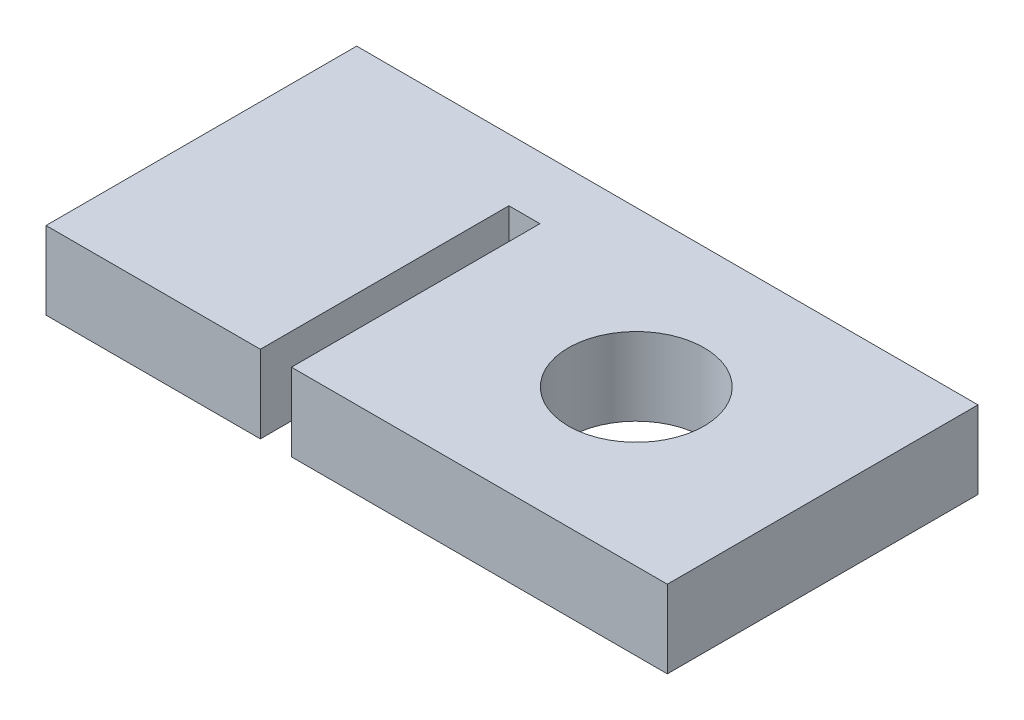
ISO-10303-21;
HEADER;
FILE_DESCRIPTION(('STEP AP214'),'2;1');
FILE_NAME('part.step','',(''),(''),'','','');
FILE_SCHEMA(('AUTOMOTIVE_DESIGN { 1 0 10303 214 1 1 1 1 }'));
ENDSEC;
DATA;
#1=APPLICATION_CONTEXT('core data for automotive mechanical design processes');
#2=APPLICATION_PROTOCOL_DEFINITION('international standard','automotive_design',2000,#1);
#3=PRODUCT_CONTEXT('',#1,'mechanical');
#4=PRODUCT('Part','Part','',(#3));
#5=PRODUCT_RELATED_PRODUCT_CATEGORY('part','',(#4));
#6=PRODUCT_DEFINITION_FORMATION('','',#4);
#7=PRODUCT_DEFINITION_CONTEXT('part definition',#1,'design');
#8=PRODUCT_DEFINITION('design','',#6,#7);
#9=PRODUCT_DEFINITION_SHAPE('','',#8);
#10=(LENGTH_UNIT() NAMED_UNIT(*) SI_UNIT(.MILLI.,.METRE.));
#11=(NAMED_UNIT(*) PLANE_ANGLE_UNIT() SI_UNIT($,.RADIAN.));
#12=(NAMED_UNIT(*) SI_UNIT($,.STERADIAN.) SOLID_ANGLE_UNIT());
#13=UNCERTAINTY_MEASURE_WITH_UNIT(LENGTH_MEASURE(1.E-05),#10,'distance_accuracy_value','');
#14=(GEOMETRIC_REPRESENTATION_CONTEXT(3) GLOBAL_UNCERTAINTY_ASSIGNED_CONTEXT((#13)) GLOBAL_UNIT_ASSIGNED_CONTEXT((#10,
#11,#12)) REPRESENTATION_CONTEXT('',''));
#15=CARTESIAN_POINT('',(0.,0.,0.));
#16=DIRECTION('',(0.,0.,1.));
#17=DIRECTION('',(1.,0.,0.));
#18=AXIS2_PLACEMENT_3D('',#15,#16,#17);
#19=CARTESIAN_POINT('',(5.,1.25,2.5));
#20=DIRECTION('',(-1.,0.,0.));
#21=DIRECTION('',(0.,0.,1.));
#22=AXIS2_PLACEMENT_3D('',#19,#20,#21);
#23=PLANE('',#22);
#24=DIRECTION('',(0.,0.,-1.));
#25=VECTOR('',#24,1.);
#26=CARTESIAN_POINT('',(5.,0.,2.5));
#27=LINE('',#26,#25);
#28=CARTESIAN_POINT('',(5.,0.,2.5));
#29=VERTEX_POINT('',#28);
#30=CARTESIAN_POINT('',(5.,0.,-2.5));
#31=VERTEX_POINT('',#30);
#32=EDGE_CURVE('E134',#29,#31,#27,.T.);
#33=ORIENTED_EDGE('',*,*,#32,.T.);
#34=DIRECTION('',(0.,-1.,0.));
#35=VECTOR('',#34,1.);
#36=CARTESIAN_POINT('',(5.,1.25,-2.5));
#37=LINE('',#36,#35);
#38=CARTESIAN_POINT('',(5.,1.25,-2.5));
#39=VERTEX_POINT('',#38);
#40=EDGE_CURVE('E11',#39,#31,#37,.T.);
#41=ORIENTED_EDGE('',*,*,#40,.F.);
#42=DIRECTION('',(0.,0.,-1.));
#43=VECTOR('',#42,1.);
#44=CARTESIAN_POINT('',(5.,1.25,2.5));
#45=LINE('',#44,#43);
#46=CARTESIAN_POINT('',(5.,1.25,2.5));
#47=VERTEX_POINT('',#46);
#48=EDGE_CURVE('E149',#47,#39,#45,.T.);
#49=ORIENTED_EDGE('',*,*,#48,.F.);
#50=DIRECTION('',(0.,-1.,0.));
#51=VECTOR('',#50,1.);
#52=CARTESIAN_POINT('',(5.,1.25,2.5));
#53=LINE('',#52,#51);
#54=EDGE_CURVE('E130',#47,#29,#53,.T.);
#55=ORIENTED_EDGE('',*,*,#54,.T.);
#56=EDGE_LOOP('',(#33,#41,#49,#55));
#57=FACE_BOUND('',#56,.T.);
#58=ADVANCED_FACE('F38',(#57),#23,.F.);
#59=CARTESIAN_POINT('',(-5.,1.25,-2.5));
#60=DIRECTION('',(0.,0.,1.));
#61=DIRECTION('',(1.,0.,0.));
#62=AXIS2_PLACEMENT_3D('',#59,#60,#61);
#63=PLANE('',#62);
#64=DIRECTION('',(-1.,0.,0.));
#65=VECTOR('',#64,1.);
#66=CARTESIAN_POINT('',(-5.,0.,-2.5));
#67=LINE('',#66,#65);
#68=CARTESIAN_POINT('',(-5.,0.,-2.5));
#69=VERTEX_POINT('',#68);
#70=EDGE_CURVE('E137',#31,#69,#67,.T.);
#71=ORIENTED_EDGE('',*,*,#70,.T.);
#72=DIRECTION('',(0.,-1.,0.));
#73=VECTOR('',#72,1.);
#74=CARTESIAN_POINT('',(-5.,1.25,-2.5));
#75=LINE('',#74,#73);
#76=CARTESIAN_POINT('',(-5.,1.25,-2.5));
#77=VERTEX_POINT('',#76);
#78=EDGE_CURVE('E46',#77,#69,#75,.T.);
#79=ORIENTED_EDGE('',*,*,#78,.F.);
#80=DIRECTION('',(-1.,0.,0.));
#81=VECTOR('',#80,1.);
#82=CARTESIAN_POINT('',(-5.,1.25,-2.5));
#83=LINE('',#82,#81);
#84=EDGE_CURVE('E97',#39,#77,#83,.T.);
#85=ORIENTED_EDGE('',*,*,#84,.F.);
#86=ORIENTED_EDGE('',*,*,#40,.T.);
#87=EDGE_LOOP('',(#71,#79,#85,#86));
#88=FACE_BOUND('',#87,.T.);
#89=ADVANCED_FACE('F205',(#88),#63,.F.);
#90=CARTESIAN_POINT('',(-5.,1.25,2.5));
#91=DIRECTION('',(1.,0.,0.));
#92=DIRECTION('',(0.,0.,-1.));
#93=AXIS2_PLACEMENT_3D('',#90,#91,#92);
#94=PLANE('',#93);
#95=DIRECTION('',(0.,0.,1.));
#96=VECTOR('',#95,1.);
#97=CARTESIAN_POINT('',(-5.,0.,2.5));
#98=LINE('',#97,#96);
#99=CARTESIAN_POINT('',(-5.,0.,2.5));
#100=VERTEX_POINT('',#99);
#101=EDGE_CURVE('E140',#69,#100,#98,.T.);
#102=ORIENTED_EDGE('',*,*,#101,.T.);
#103=DIRECTION('',(0.,-1.,0.));
#104=VECTOR('',#103,1.);
#105=CARTESIAN_POINT('',(-5.,1.25,2.5));
#106=LINE('',#105,#104);
#107=CARTESIAN_POINT('',(-5.,1.25,2.5));
#108=VERTEX_POINT('',#107);
#109=EDGE_CURVE('E156',#108,#100,#106,.T.);
#110=ORIENTED_EDGE('',*,*,#109,.F.);
#111=DIRECTION('',(0.,0.,1.));
#112=VECTOR('',#111,1.);
#113=CARTESIAN_POINT('',(-5.,1.25,2.5));
#114=LINE('',#113,#112);
#115=EDGE_CURVE('E164',#77,#108,#114,.T.);
#116=ORIENTED_EDGE('',*,*,#115,.F.);
#117=ORIENTED_EDGE('',*,*,#78,.T.);
#118=EDGE_LOOP('',(#102,#110,#116,#117));
#119=FACE_BOUND('',#118,.T.);
#120=ADVANCED_FACE('F162',(#119),#94,.F.);
#121=CARTESIAN_POINT('',(-5.,1.25,2.5));
#122=DIRECTION('',(0.,0.,-1.));
#123=DIRECTION('',(-1.,0.,0.));
#124=AXIS2_PLACEMENT_3D('',#121,#122,#123);
#125=PLANE('',#124);
#126=DIRECTION('',(1.,0.,0.));
#127=VECTOR('',#126,1.);
#128=CARTESIAN_POINT('',(-5.,0.,2.5));
#129=LINE('',#128,#127);
#130=CARTESIAN_POINT('',(-1.55,0.,2.5));
#131=VERTEX_POINT('',#130);
#132=EDGE_CURVE('E142',#100,#131,#129,.T.);
#133=ORIENTED_EDGE('',*,*,#132,.T.);
#134=DIRECTION('',(0.,-1.,0.));
#135=VECTOR('',#134,1.);
#136=CARTESIAN_POINT('',(-1.55,1.25,2.5));
#137=LINE('',#136,#135);
#138=CARTESIAN_POINT('',(-1.55,1.25,2.5));
#139=VERTEX_POINT('',#138);
#140=EDGE_CURVE('E153',#139,#131,#137,.T.);
#141=ORIENTED_EDGE('',*,*,#140,.F.);
#142=DIRECTION('',(1.,0.,0.));
#143=VECTOR('',#142,1.);
#144=CARTESIAN_POINT('',(-5.,1.25,2.5));
#145=LINE('',#144,#143);
#146=EDGE_CURVE('E176',#108,#139,#145,.T.);
#147=ORIENTED_EDGE('',*,*,#146,.F.);
#148=ORIENTED_EDGE('',*,*,#109,.T.);
#149=EDGE_LOOP('',(#133,#141,#147,#148));
#150=FACE_BOUND('',#149,.T.);
#151=ADVANCED_FACE('F172',(#150),#125,.F.);
#152=CARTESIAN_POINT('',(-1.55,1.25,2.5));
#153=DIRECTION('',(-1.,0.,0.));
#154=DIRECTION('',(0.,0.,1.));
#155=AXIS2_PLACEMENT_3D('',#152,#153,#154);
#156=PLANE('',#155);
#157=DIRECTION('',(0.,0.,-1.));
#158=VECTOR('',#157,1.);
#159=CARTESIAN_POINT('',(-1.55,0.,2.5));
#160=LINE('',#159,#158);
#161=CARTESIAN_POINT('',(-1.55,0.,-1.5));
#162=VERTEX_POINT('',#161);
#163=EDGE_CURVE('E144',#131,#162,#160,.T.);
#164=ORIENTED_EDGE('',*,*,#163,.T.);
#165=DIRECTION('',(0.,-1.,0.));
#166=VECTOR('',#165,1.);
#167=CARTESIAN_POINT('',(-1.55,1.25,-1.5));
#168=LINE('',#167,#166);
#169=CARTESIAN_POINT('',(-1.55,1.25,-1.5));
#170=VERTEX_POINT('',#169);
#171=EDGE_CURVE('E125',#170,#162,#168,.T.);
#172=ORIENTED_EDGE('',*,*,#171,.F.);
#173=DIRECTION('',(0.,0.,-1.));
#174=VECTOR('',#173,1.);
#175=CARTESIAN_POINT('',(-1.55,1.25,2.5));
#176=LINE('',#175,#174);
#177=EDGE_CURVE('E116',#139,#170,#176,.T.);
#178=ORIENTED_EDGE('',*,*,#177,.F.);
#179=ORIENTED_EDGE('',*,*,#140,.T.);
#180=EDGE_LOOP('',(#164,#172,#178,#179));
#181=FACE_BOUND('',#180,.T.);
#182=ADVANCED_FACE('F175',(#181),#156,.F.);
#183=CARTESIAN_POINT('',(-1.55,1.25,-1.5));
#184=DIRECTION('',(0.,0.,-1.));
#185=DIRECTION('',(-1.,0.,0.));
#186=AXIS2_PLACEMENT_3D('',#183,#184,#185);
#187=PLANE('',#186);
#188=DIRECTION('',(1.,0.,0.));
#189=VECTOR('',#188,1.);
#190=CARTESIAN_POINT('',(-1.55,0.,-1.5));
#191=LINE('',#190,#189);
#192=CARTESIAN_POINT('',(-1.05,0.,-1.5));
#193=VERTEX_POINT('',#192);
#194=EDGE_CURVE('E124',#162,#193,#191,.T.);
#195=ORIENTED_EDGE('',*,*,#194,.T.);
#196=DIRECTION('',(0.,-1.,0.));
#197=VECTOR('',#196,1.);
#198=CARTESIAN_POINT('',(-1.05,1.25,-1.5));
#199=LINE('',#198,#197);
#200=CARTESIAN_POINT('',(-1.05,1.25,-1.5));
#201=VERTEX_POINT('',#200);
#202=EDGE_CURVE('E121',#201,#193,#199,.T.);
#203=ORIENTED_EDGE('',*,*,#202,.F.);
#204=DIRECTION('',(1.,0.,0.));
#205=VECTOR('',#204,1.);
#206=CARTESIAN_POINT('',(-1.55,1.25,-1.5));
#207=LINE('',#206,#205);
#208=EDGE_CURVE('E110',#170,#201,#207,.T.);
#209=ORIENTED_EDGE('',*,*,#208,.F.);
#210=ORIENTED_EDGE('',*,*,#171,.T.);
#211=EDGE_LOOP('',(#195,#203,#209,#210));
#212=FACE_BOUND('',#211,.T.);
#213=ADVANCED_FACE('F122',(#212),#187,.F.);
#214=CARTESIAN_POINT('',(-1.05,1.25,2.5));
#215=DIRECTION('',(1.,0.,0.));
#216=DIRECTION('',(0.,0.,-1.));
#217=AXIS2_PLACEMENT_3D('',#214,#215,#216);
#218=PLANE('',#217);
#219=DIRECTION('',(0.,0.,1.));
#220=VECTOR('',#219,1.);
#221=CARTESIAN_POINT('',(-1.05,0.,2.5));
#222=LINE('',#221,#220);
#223=CARTESIAN_POINT('',(-1.05,0.,2.5));
#224=VERTEX_POINT('',#223);
#225=EDGE_CURVE('E83',#193,#224,#222,.T.);
#226=ORIENTED_EDGE('',*,*,#225,.T.);
#227=DIRECTION('',(0.,-1.,0.));
#228=VECTOR('',#227,1.);
#229=CARTESIAN_POINT('',(-1.05,1.25,2.5));
#230=LINE('',#229,#228);
#231=CARTESIAN_POINT('',(-1.05,1.25,2.5));
#232=VERTEX_POINT('',#231);
#233=EDGE_CURVE('E126',#232,#224,#230,.T.);
#234=ORIENTED_EDGE('',*,*,#233,.F.);
#235=DIRECTION('',(0.,0.,1.));
#236=VECTOR('',#235,1.);
#237=CARTESIAN_POINT('',(-1.05,1.25,2.5));
#238=LINE('',#237,#236);
#239=EDGE_CURVE('E114',#201,#232,#238,.T.);
#240=ORIENTED_EDGE('',*,*,#239,.F.);
#241=ORIENTED_EDGE('',*,*,#202,.T.);
#242=EDGE_LOOP('',(#226,#234,#240,#241));
#243=FACE_BOUND('',#242,.T.);
#244=ADVANCED_FACE('F128',(#243),#218,.F.);
#245=CARTESIAN_POINT('',(-1.05,1.25,2.5));
#246=DIRECTION('',(0.,0.,-1.));
#247=DIRECTION('',(-1.,0.,0.));
#248=AXIS2_PLACEMENT_3D('',#245,#246,#247);
#249=PLANE('',#248);
#250=DIRECTION('',(1.,0.,0.));
#251=VECTOR('',#250,1.);
#252=CARTESIAN_POINT('',(-1.05,0.,2.5));
#253=LINE('',#252,#251);
#254=EDGE_CURVE('E89',#224,#29,#253,.T.);
#255=ORIENTED_EDGE('',*,*,#254,.T.);
#256=ORIENTED_EDGE('',*,*,#54,.F.);
#257=DIRECTION('',(1.,0.,0.));
#258=VECTOR('',#257,1.);
#259=CARTESIAN_POINT('',(-1.05,1.25,2.5));
#260=LINE('',#259,#258);
#261=EDGE_CURVE('E54',#232,#47,#260,.T.);
#262=ORIENTED_EDGE('',*,*,#261,.F.);
#263=ORIENTED_EDGE('',*,*,#233,.T.);
#264=EDGE_LOOP('',(#255,#256,#262,#263));
#265=FACE_BOUND('',#264,.T.);
#266=ADVANCED_FACE('F196',(#265),#249,.F.);
#267=CARTESIAN_POINT('',(0.,1.25,0.));
#268=DIRECTION('',(0.,-1.,0.));
#269=DIRECTION('',(0.,0.,-1.));
#270=AXIS2_PLACEMENT_3D('',#267,#268,#269);
#271=PLANE('',#270);
#272=CARTESIAN_POINT('',(2.,1.25,0.));
#273=DIRECTION('',(0.,1.,0.));
#274=DIRECTION('',(0.,0.,1.));
#275=AXIS2_PLACEMENT_3D('',#272,#273,#274);
#276=CIRCLE('',#275,1.0922);
#277=CARTESIAN_POINT('',(2.,1.25,1.0922));
#278=VERTEX_POINT('',#277);
#279=EDGE_CURVE('E182',#278,#278,#276,.T.);
#280=ORIENTED_EDGE('',*,*,#279,.F.);
#281=EDGE_LOOP('',(#280));
#282=FACE_BOUND('',#281,.T.);
#283=ORIENTED_EDGE('',*,*,#48,.T.);
#284=ORIENTED_EDGE('',*,*,#84,.T.);
#285=ORIENTED_EDGE('',*,*,#115,.T.);
#286=ORIENTED_EDGE('',*,*,#146,.T.);
#287=ORIENTED_EDGE('',*,*,#177,.T.);
#288=ORIENTED_EDGE('',*,*,#208,.T.);
#289=ORIENTED_EDGE('',*,*,#239,.T.);
#290=ORIENTED_EDGE('',*,*,#261,.T.);
#291=EDGE_LOOP('',(#283,#284,#285,#286,#287,#288,#289,#290));
#292=FACE_BOUND('',#291,.T.);
#293=ADVANCED_FACE('F112',(#282,#292),#271,.F.);
#294=CARTESIAN_POINT('',(0.,0.,0.));
#295=DIRECTION('',(0.,-1.,0.));
#296=DIRECTION('',(0.,0.,-1.));
#297=AXIS2_PLACEMENT_3D('',#294,#295,#296);
#298=PLANE('',#297);
#299=CARTESIAN_POINT('',(2.,0.,0.));
#300=DIRECTION('',(0.,1.,0.));
#301=DIRECTION('',(0.,0.,1.));
#302=AXIS2_PLACEMENT_3D('',#299,#300,#301);
#303=CIRCLE('',#302,1.0922);
#304=CARTESIAN_POINT('',(2.,0.,1.0922));
#305=VERTEX_POINT('',#304);
#306=EDGE_CURVE('E138',#305,#305,#303,.T.);
#307=ORIENTED_EDGE('',*,*,#306,.T.);
#308=EDGE_LOOP('',(#307));
#309=FACE_BOUND('',#308,.T.);
#310=ORIENTED_EDGE('',*,*,#32,.F.);
#311=ORIENTED_EDGE('',*,*,#254,.F.);
#312=ORIENTED_EDGE('',*,*,#225,.F.);
#313=ORIENTED_EDGE('',*,*,#194,.F.);
#314=ORIENTED_EDGE('',*,*,#163,.F.);
#315=ORIENTED_EDGE('',*,*,#132,.F.);
#316=ORIENTED_EDGE('',*,*,#101,.F.);
#317=ORIENTED_EDGE('',*,*,#70,.F.);
#318=EDGE_LOOP('',(#310,#311,#312,#313,#314,#315,#316,#317));
#319=FACE_BOUND('',#318,.T.);
#320=ADVANCED_FACE('F168',(#309,#319),#298,.T.);
#321=CARTESIAN_POINT('',(2.,0.,0.));
#322=DIRECTION('',(0.,1.,0.));
#323=DIRECTION('',(0.,0.,1.));
#324=AXIS2_PLACEMENT_3D('',#321,#322,#323);
#325=CYLINDRICAL_SURFACE('',#324,1.0922);
#326=ORIENTED_EDGE('',*,*,#306,.F.);
#327=EDGE_LOOP('',(#326));
#328=FACE_BOUND('',#327,.T.);
#329=ORIENTED_EDGE('',*,*,#279,.T.);
#330=EDGE_LOOP('',(#329));
#331=FACE_BOUND('',#330,.T.);
#332=ADVANCED_FACE('F189',(#328,#331),#325,.F.);
#333=CLOSED_SHELL('',(#58,#89,#120,#151,#182,#213,#244,#266,#293,#320,#332));
#334=MANIFOLD_SOLID_BREP('B2',#333);
#335=ADVANCED_BREP_SHAPE_REPRESENTATION('',(#18,#334),#14);
#336=SHAPE_DEFINITION_REPRESENTATION(#9,#335);
ENDSEC;
END-ISO-10303-21;
